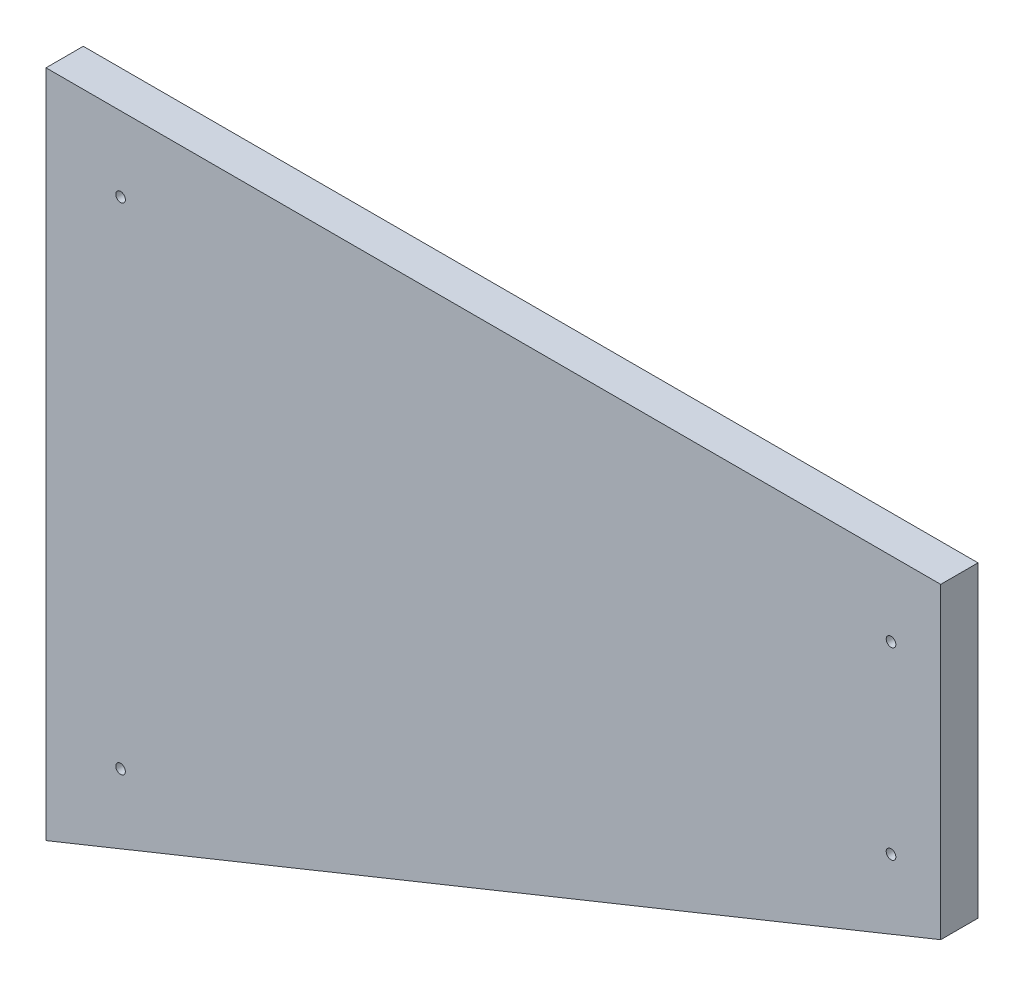
ISO-10303-21;
HEADER;
FILE_DESCRIPTION(('STEP AP214'),'2;1');
FILE_NAME('part.step','',(''),(''),'','','');
FILE_SCHEMA(('AUTOMOTIVE_DESIGN { 1 0 10303 214 1 1 1 1 }'));
ENDSEC;
DATA;
#1=APPLICATION_CONTEXT('core data for automotive mechanical design processes');
#2=APPLICATION_PROTOCOL_DEFINITION('international standard','automotive_design',2000,#1);
#3=PRODUCT_CONTEXT('',#1,'mechanical');
#4=PRODUCT('Part','Part','',(#3));
#5=PRODUCT_RELATED_PRODUCT_CATEGORY('part','',(#4));
#6=PRODUCT_DEFINITION_FORMATION('','',#4);
#7=PRODUCT_DEFINITION_CONTEXT('part definition',#1,'design');
#8=PRODUCT_DEFINITION('design','',#6,#7);
#9=PRODUCT_DEFINITION_SHAPE('','',#8);
#10=(LENGTH_UNIT() NAMED_UNIT(*) SI_UNIT(.MILLI.,.METRE.));
#11=(NAMED_UNIT(*) PLANE_ANGLE_UNIT() SI_UNIT($,.RADIAN.));
#12=(NAMED_UNIT(*) SI_UNIT($,.STERADIAN.) SOLID_ANGLE_UNIT());
#13=UNCERTAINTY_MEASURE_WITH_UNIT(LENGTH_MEASURE(1.E-05),#10,'distance_accuracy_value','');
#14=(GEOMETRIC_REPRESENTATION_CONTEXT(3) GLOBAL_UNCERTAINTY_ASSIGNED_CONTEXT((#13)) GLOBAL_UNIT_ASSIGNED_CONTEXT((#10,
#11,#12)) REPRESENTATION_CONTEXT('',''));
#15=CARTESIAN_POINT('',(0.,0.,0.));
#16=DIRECTION('',(0.,0.,1.));
#17=DIRECTION('',(1.,0.,0.));
#18=AXIS2_PLACEMENT_3D('',#15,#16,#17);
#19=CARTESIAN_POINT('',(3140.70999999981,6983.72999014018,19.05));
#20=DIRECTION('',(0.,-1.,0.));
#21=DIRECTION('',(1.,0.,0.));
#22=AXIS2_PLACEMENT_3D('',#19,#20,#21);
#23=PLANE('',#22);
#24=DIRECTION('',(-1.,0.,0.));
#25=VECTOR('',#24,1.);
#26=CARTESIAN_POINT('',(3140.70999999981,6983.72999014018,0.));
#27=LINE('',#26,#25);
#28=CARTESIAN_POINT('',(3140.70999999981,6983.72999014018,0.));
#29=VERTEX_POINT('',#28);
#30=CARTESIAN_POINT('',(2683.50999999981,6983.72999014018,0.));
#31=VERTEX_POINT('',#30);
#32=EDGE_CURVE('E100',#29,#31,#27,.T.);
#33=ORIENTED_EDGE('',*,*,#32,.T.);
#34=DIRECTION('',(0.,0.,-1.));
#35=VECTOR('',#34,1.);
#36=CARTESIAN_POINT('',(2683.50999999981,6983.72999014018,19.05));
#37=LINE('',#36,#35);
#38=CARTESIAN_POINT('',(2683.50999999981,6983.72999014018,19.05));
#39=VERTEX_POINT('',#38);
#40=EDGE_CURVE('E11',#39,#31,#37,.T.);
#41=ORIENTED_EDGE('',*,*,#40,.F.);
#42=DIRECTION('',(-1.,0.,0.));
#43=VECTOR('',#42,1.);
#44=CARTESIAN_POINT('',(3140.70999999981,6983.72999014018,19.05));
#45=LINE('',#44,#43);
#46=CARTESIAN_POINT('',(3140.70999999981,6983.72999014018,19.05));
#47=VERTEX_POINT('',#46);
#48=EDGE_CURVE('E88',#47,#39,#45,.T.);
#49=ORIENTED_EDGE('',*,*,#48,.F.);
#50=DIRECTION('',(0.,0.,-1.));
#51=VECTOR('',#50,1.);
#52=CARTESIAN_POINT('',(3140.70999999981,6983.72999014018,19.05));
#53=LINE('',#52,#51);
#54=EDGE_CURVE('E96',#47,#29,#53,.T.);
#55=ORIENTED_EDGE('',*,*,#54,.T.);
#56=EDGE_LOOP('',(#33,#41,#49,#55));
#57=FACE_BOUND('',#56,.T.);
#58=ADVANCED_FACE('F37',(#57),#23,.F.);
#59=CARTESIAN_POINT('',(2683.50999999981,6983.72999014018,19.05));
#60=DIRECTION('',(1.,0.,0.));
#61=DIRECTION('',(0.,0.,-1.));
#62=AXIS2_PLACEMENT_3D('',#59,#60,#61);
#63=PLANE('',#62);
#64=DIRECTION('',(0.,-1.,0.));
#65=VECTOR('',#64,1.);
#66=CARTESIAN_POINT('',(2683.50999999981,6983.72999014018,0.));
#67=LINE('',#66,#65);
#68=CARTESIAN_POINT('',(2683.50999999981,6641.74188684795,0.));
#69=VERTEX_POINT('',#68);
#70=EDGE_CURVE('E92',#31,#69,#67,.T.);
#71=ORIENTED_EDGE('',*,*,#70,.T.);
#72=DIRECTION('',(0.,0.,-1.));
#73=VECTOR('',#72,1.);
#74=CARTESIAN_POINT('',(2683.50999999981,6641.74188684795,19.05));
#75=LINE('',#74,#73);
#76=CARTESIAN_POINT('',(2683.50999999981,6641.74188684795,19.05));
#77=VERTEX_POINT('',#76);
#78=EDGE_CURVE('E45',#77,#69,#75,.T.);
#79=ORIENTED_EDGE('',*,*,#78,.F.);
#80=DIRECTION('',(0.,-1.,0.));
#81=VECTOR('',#80,1.);
#82=CARTESIAN_POINT('',(2683.50999999981,6983.72999014018,19.05));
#83=LINE('',#82,#81);
#84=EDGE_CURVE('E83',#39,#77,#83,.T.);
#85=ORIENTED_EDGE('',*,*,#84,.F.);
#86=ORIENTED_EDGE('',*,*,#40,.T.);
#87=EDGE_LOOP('',(#71,#79,#85,#86));
#88=FACE_BOUND('',#87,.T.);
#89=ADVANCED_FACE('F91',(#88),#63,.F.);
#90=CARTESIAN_POINT('',(2683.50999999981,6641.74188684795,19.05));
#91=DIRECTION('',(-0.374606593415956,0.927183854566769,0.));
#92=DIRECTION('',(-0.92718385456677,-0.374606593415956,0.));
#93=AXIS2_PLACEMENT_3D('',#90,#91,#92);
#94=PLANE('',#93);
#95=DIRECTION('',(0.927183854566769,0.374606593415956,0.));
#96=VECTOR('',#95,1.);
#97=CARTESIAN_POINT('',(2683.50999999981,6641.74188684795,0.));
#98=LINE('',#97,#96);
#99=CARTESIAN_POINT('',(3140.70999999981,6826.46267729981,0.));
#100=VERTEX_POINT('',#99);
#101=EDGE_CURVE('E70',#69,#100,#98,.T.);
#102=ORIENTED_EDGE('',*,*,#101,.T.);
#103=DIRECTION('',(0.,0.,-1.));
#104=VECTOR('',#103,1.);
#105=CARTESIAN_POINT('',(3140.70999999981,6826.46267729981,19.05));
#106=LINE('',#105,#104);
#107=CARTESIAN_POINT('',(3140.70999999981,6826.46267729981,19.05));
#108=VERTEX_POINT('',#107);
#109=EDGE_CURVE('E93',#108,#100,#106,.T.);
#110=ORIENTED_EDGE('',*,*,#109,.F.);
#111=DIRECTION('',(0.927183854566769,0.374606593415956,0.));
#112=VECTOR('',#111,1.);
#113=CARTESIAN_POINT('',(2683.50999999981,6641.74188684795,19.05));
#114=LINE('',#113,#112);
#115=EDGE_CURVE('E86',#77,#108,#114,.T.);
#116=ORIENTED_EDGE('',*,*,#115,.F.);
#117=ORIENTED_EDGE('',*,*,#78,.T.);
#118=EDGE_LOOP('',(#102,#110,#116,#117));
#119=FACE_BOUND('',#118,.T.);
#120=ADVANCED_FACE('F94',(#119),#94,.F.);
#121=CARTESIAN_POINT('',(3140.70999999981,6826.46267729981,19.05));
#122=DIRECTION('',(-1.,0.,0.));
#123=DIRECTION('',(0.,0.,1.));
#124=AXIS2_PLACEMENT_3D('',#121,#122,#123);
#125=PLANE('',#124);
#126=DIRECTION('',(0.,1.,0.));
#127=VECTOR('',#126,1.);
#128=CARTESIAN_POINT('',(3140.70999999981,6826.46267729981,0.));
#129=LINE('',#128,#127);
#130=EDGE_CURVE('E76',#100,#29,#129,.T.);
#131=ORIENTED_EDGE('',*,*,#130,.T.);
#132=ORIENTED_EDGE('',*,*,#54,.F.);
#133=DIRECTION('',(0.,1.,0.));
#134=VECTOR('',#133,1.);
#135=CARTESIAN_POINT('',(3140.70999999981,6826.46267729981,19.05));
#136=LINE('',#135,#134);
#137=EDGE_CURVE('E53',#108,#47,#136,.T.);
#138=ORIENTED_EDGE('',*,*,#137,.F.);
#139=ORIENTED_EDGE('',*,*,#109,.T.);
#140=EDGE_LOOP('',(#131,#132,#138,#139));
#141=FACE_BOUND('',#140,.T.);
#142=ADVANCED_FACE('F108',(#141),#125,.F.);
#143=CARTESIAN_POINT('',(0.,0.,19.05));
#144=DIRECTION('',(0.,0.,1.));
#145=DIRECTION('',(1.,0.,0.));
#146=AXIS2_PLACEMENT_3D('',#143,#144,#145);
#147=PLANE('',#146);
#148=CARTESIAN_POINT('',(2721.61000000056,6692.54189162913,19.05));
#149=DIRECTION('',(0.,0.,-1.));
#150=DIRECTION('',(-1.,0.,0.));
#151=AXIS2_PLACEMENT_3D('',#148,#149,#150);
#152=CIRCLE('',#151,2.45745000000008);
#153=CARTESIAN_POINT('',(2719.15255000056,6692.54189162913,19.05));
#154=VERTEX_POINT('',#153);
#155=EDGE_CURVE('E140',#154,#154,#152,.T.);
#156=ORIENTED_EDGE('',*,*,#155,.T.);
#157=EDGE_LOOP('',(#156));
#158=FACE_BOUND('',#157,.T.);
#159=CARTESIAN_POINT('',(2721.61000000058,6945.62999492127,19.05));
#160=DIRECTION('',(0.,0.,-1.));
#161=DIRECTION('',(-1.,0.,0.));
#162=AXIS2_PLACEMENT_3D('',#159,#160,#161);
#163=CIRCLE('',#162,2.45745000000008);
#164=CARTESIAN_POINT('',(2719.15255000058,6945.62999492127,19.05));
#165=VERTEX_POINT('',#164);
#166=EDGE_CURVE('E131',#165,#165,#163,.T.);
#167=ORIENTED_EDGE('',*,*,#166,.T.);
#168=EDGE_LOOP('',(#167));
#169=FACE_BOUND('',#168,.T.);
#170=CARTESIAN_POINT('',(3115.31000000058,6945.62999492124,19.05));
#171=DIRECTION('',(0.,0.,-1.));
#172=DIRECTION('',(-1.,0.,0.));
#173=AXIS2_PLACEMENT_3D('',#170,#171,#172);
#174=CIRCLE('',#173,2.45745000000008);
#175=CARTESIAN_POINT('',(3112.85255000058,6945.62999492124,19.05));
#176=VERTEX_POINT('',#175);
#177=EDGE_CURVE('E122',#176,#176,#174,.T.);
#178=ORIENTED_EDGE('',*,*,#177,.T.);
#179=EDGE_LOOP('',(#178));
#180=FACE_BOUND('',#179,.T.);
#181=CARTESIAN_POINT('',(3115.31000000057,6851.60701674041,19.05));
#182=DIRECTION('',(0.,0.,-1.));
#183=DIRECTION('',(-1.,0.,0.));
#184=AXIS2_PLACEMENT_3D('',#181,#182,#183);
#185=CIRCLE('',#184,2.45745000000008);
#186=CARTESIAN_POINT('',(3112.85255000057,6851.60701674041,19.05));
#187=VERTEX_POINT('',#186);
#188=EDGE_CURVE('E103',#187,#187,#185,.T.);
#189=ORIENTED_EDGE('',*,*,#188,.T.);
#190=EDGE_LOOP('',(#189));
#191=FACE_BOUND('',#190,.T.);
#192=ORIENTED_EDGE('',*,*,#48,.T.);
#193=ORIENTED_EDGE('',*,*,#84,.T.);
#194=ORIENTED_EDGE('',*,*,#115,.T.);
#195=ORIENTED_EDGE('',*,*,#137,.T.);
#196=EDGE_LOOP('',(#192,#193,#194,#195));
#197=FACE_BOUND('',#196,.T.);
#198=ADVANCED_FACE('F84',(#158,#169,#180,#191,#197),#147,.T.);
#199=CARTESIAN_POINT('',(0.,0.,0.));
#200=DIRECTION('',(0.,0.,1.));
#201=DIRECTION('',(1.,0.,0.));
#202=AXIS2_PLACEMENT_3D('',#199,#200,#201);
#203=PLANE('',#202);
#204=CARTESIAN_POINT('',(2721.61000000056,6692.54189162913,0.));
#205=DIRECTION('',(0.,0.,-1.));
#206=DIRECTION('',(-1.,0.,0.));
#207=AXIS2_PLACEMENT_3D('',#204,#205,#206);
#208=CIRCLE('',#207,4.21639999999979);
#209=CARTESIAN_POINT('',(2717.39360000056,6692.54189162913,0.));
#210=VERTEX_POINT('',#209);
#211=EDGE_CURVE('E146',#210,#210,#208,.T.);
#212=ORIENTED_EDGE('',*,*,#211,.F.);
#213=EDGE_LOOP('',(#212));
#214=FACE_BOUND('',#213,.T.);
#215=CARTESIAN_POINT('',(2721.61000000058,6945.62999492127,0.));
#216=DIRECTION('',(0.,0.,-1.));
#217=DIRECTION('',(-1.,0.,0.));
#218=AXIS2_PLACEMENT_3D('',#215,#216,#217);
#219=CIRCLE('',#218,4.21639999999979);
#220=CARTESIAN_POINT('',(2717.39360000058,6945.62999492127,0.));
#221=VERTEX_POINT('',#220);
#222=EDGE_CURVE('E137',#221,#221,#219,.T.);
#223=ORIENTED_EDGE('',*,*,#222,.F.);
#224=EDGE_LOOP('',(#223));
#225=FACE_BOUND('',#224,.T.);
#226=CARTESIAN_POINT('',(3115.31000000058,6945.62999492124,0.));
#227=DIRECTION('',(0.,0.,-1.));
#228=DIRECTION('',(-1.,0.,0.));
#229=AXIS2_PLACEMENT_3D('',#226,#227,#228);
#230=CIRCLE('',#229,4.21639999999979);
#231=CARTESIAN_POINT('',(3111.09360000058,6945.62999492124,0.));
#232=VERTEX_POINT('',#231);
#233=EDGE_CURVE('E128',#232,#232,#230,.T.);
#234=ORIENTED_EDGE('',*,*,#233,.F.);
#235=EDGE_LOOP('',(#234));
#236=FACE_BOUND('',#235,.T.);
#237=CARTESIAN_POINT('',(3115.31000000057,6851.60701674041,0.));
#238=DIRECTION('',(0.,0.,-1.));
#239=DIRECTION('',(-1.,0.,0.));
#240=AXIS2_PLACEMENT_3D('',#237,#238,#239);
#241=CIRCLE('',#240,4.21639999999979);
#242=CARTESIAN_POINT('',(3111.09360000057,6851.60701674041,0.));
#243=VERTEX_POINT('',#242);
#244=EDGE_CURVE('E119',#243,#243,#241,.T.);
#245=ORIENTED_EDGE('',*,*,#244,.F.);
#246=EDGE_LOOP('',(#245));
#247=FACE_BOUND('',#246,.T.);
#248=ORIENTED_EDGE('',*,*,#32,.F.);
#249=ORIENTED_EDGE('',*,*,#130,.F.);
#250=ORIENTED_EDGE('',*,*,#101,.F.);
#251=ORIENTED_EDGE('',*,*,#70,.F.);
#252=EDGE_LOOP('',(#248,#249,#250,#251));
#253=FACE_BOUND('',#252,.T.);
#254=ADVANCED_FACE('F111',(#214,#225,#236,#247,#253),#203,.F.);
#255=CARTESIAN_POINT('',(3115.31000000057,6851.60701674041,0.));
#256=DIRECTION('',(0.,0.,-1.));
#257=DIRECTION('',(-1.,0.,0.));
#258=AXIS2_PLACEMENT_3D('',#255,#256,#257);
#259=CYLINDRICAL_SURFACE('',#258,2.45745000000008);
#260=ORIENTED_EDGE('',*,*,#188,.F.);
#261=EDGE_LOOP('',(#260));
#262=FACE_BOUND('',#261,.T.);
#263=CARTESIAN_POINT('',(3115.31000000057,6851.60701674041,1.47593429625929));
#264=DIRECTION('',(0.,0.,-1.));
#265=DIRECTION('',(-1.,0.,0.));
#266=AXIS2_PLACEMENT_3D('',#263,#264,#265);
#267=CIRCLE('',#266,2.45745000000008);
#268=CARTESIAN_POINT('',(3112.85255000057,6851.60701674041,1.47593429625929));
#269=VERTEX_POINT('',#268);
#270=EDGE_CURVE('E116',#269,#269,#267,.T.);
#271=ORIENTED_EDGE('',*,*,#270,.T.);
#272=EDGE_LOOP('',(#271));
#273=FACE_BOUND('',#272,.T.);
#274=ADVANCED_FACE('F154',(#262,#273),#259,.F.);
#275=CARTESIAN_POINT('',(3115.31000000057,6851.60701674041,0.));
#276=DIRECTION('',(0.,0.,-1.));
#277=DIRECTION('',(-1.,0.,0.));
#278=AXIS2_PLACEMENT_3D('',#275,#276,#277);
#279=CONICAL_SURFACE('',#278,4.21639999999979,0.872664625997076);
#280=ORIENTED_EDGE('',*,*,#270,.F.);
#281=EDGE_LOOP('',(#280));
#282=FACE_BOUND('',#281,.T.);
#283=ORIENTED_EDGE('',*,*,#244,.T.);
#284=EDGE_LOOP('',(#283));
#285=FACE_BOUND('',#284,.T.);
#286=ADVANCED_FACE('F162',(#282,#285),#279,.F.);
#287=CARTESIAN_POINT('',(3115.31000000058,6945.62999492124,0.));
#288=DIRECTION('',(0.,0.,-1.));
#289=DIRECTION('',(-1.,0.,0.));
#290=AXIS2_PLACEMENT_3D('',#287,#288,#289);
#291=CYLINDRICAL_SURFACE('',#290,2.45745000000008);
#292=ORIENTED_EDGE('',*,*,#177,.F.);
#293=EDGE_LOOP('',(#292));
#294=FACE_BOUND('',#293,.T.);
#295=CARTESIAN_POINT('',(3115.31000000058,6945.62999492124,1.47593429625929));
#296=DIRECTION('',(0.,0.,-1.));
#297=DIRECTION('',(-1.,0.,0.));
#298=AXIS2_PLACEMENT_3D('',#295,#296,#297);
#299=CIRCLE('',#298,2.45745000000008);
#300=CARTESIAN_POINT('',(3112.85255000058,6945.62999492124,1.47593429625929));
#301=VERTEX_POINT('',#300);
#302=EDGE_CURVE('E125',#301,#301,#299,.T.);
#303=ORIENTED_EDGE('',*,*,#302,.T.);
#304=EDGE_LOOP('',(#303));
#305=FACE_BOUND('',#304,.T.);
#306=ADVANCED_FACE('F164',(#294,#305),#291,.F.);
#307=CARTESIAN_POINT('',(3115.31000000058,6945.62999492124,0.));
#308=DIRECTION('',(0.,0.,-1.));
#309=DIRECTION('',(-1.,0.,0.));
#310=AXIS2_PLACEMENT_3D('',#307,#308,#309);
#311=CONICAL_SURFACE('',#310,4.21639999999979,0.872664625997076);
#312=ORIENTED_EDGE('',*,*,#302,.F.);
#313=EDGE_LOOP('',(#312));
#314=FACE_BOUND('',#313,.T.);
#315=ORIENTED_EDGE('',*,*,#233,.T.);
#316=EDGE_LOOP('',(#315));
#317=FACE_BOUND('',#316,.T.);
#318=ADVANCED_FACE('F171',(#314,#317),#311,.F.);
#319=CARTESIAN_POINT('',(2721.61000000058,6945.62999492127,0.));
#320=DIRECTION('',(0.,0.,-1.));
#321=DIRECTION('',(-1.,0.,0.));
#322=AXIS2_PLACEMENT_3D('',#319,#320,#321);
#323=CYLINDRICAL_SURFACE('',#322,2.45745000000008);
#324=ORIENTED_EDGE('',*,*,#166,.F.);
#325=EDGE_LOOP('',(#324));
#326=FACE_BOUND('',#325,.T.);
#327=CARTESIAN_POINT('',(2721.61000000058,6945.62999492127,1.47593429625929));
#328=DIRECTION('',(0.,0.,-1.));
#329=DIRECTION('',(-1.,0.,0.));
#330=AXIS2_PLACEMENT_3D('',#327,#328,#329);
#331=CIRCLE('',#330,2.45745000000008);
#332=CARTESIAN_POINT('',(2719.15255000058,6945.62999492127,1.47593429625929));
#333=VERTEX_POINT('',#332);
#334=EDGE_CURVE('E134',#333,#333,#331,.T.);
#335=ORIENTED_EDGE('',*,*,#334,.T.);
#336=EDGE_LOOP('',(#335));
#337=FACE_BOUND('',#336,.T.);
#338=ADVANCED_FACE('F205',(#326,#337),#323,.F.);
#339=CARTESIAN_POINT('',(2721.61000000058,6945.62999492127,0.));
#340=DIRECTION('',(0.,0.,-1.));
#341=DIRECTION('',(-1.,0.,0.));
#342=AXIS2_PLACEMENT_3D('',#339,#340,#341);
#343=CONICAL_SURFACE('',#342,4.21639999999979,0.872664625997076);
#344=ORIENTED_EDGE('',*,*,#334,.F.);
#345=EDGE_LOOP('',(#344));
#346=FACE_BOUND('',#345,.T.);
#347=ORIENTED_EDGE('',*,*,#222,.T.);
#348=EDGE_LOOP('',(#347));
#349=FACE_BOUND('',#348,.T.);
#350=ADVANCED_FACE('F210',(#346,#349),#343,.F.);
#351=CARTESIAN_POINT('',(2721.61000000056,6692.54189162913,0.));
#352=DIRECTION('',(0.,0.,-1.));
#353=DIRECTION('',(-1.,0.,0.));
#354=AXIS2_PLACEMENT_3D('',#351,#352,#353);
#355=CYLINDRICAL_SURFACE('',#354,2.45745000000008);
#356=ORIENTED_EDGE('',*,*,#155,.F.);
#357=EDGE_LOOP('',(#356));
#358=FACE_BOUND('',#357,.T.);
#359=CARTESIAN_POINT('',(2721.61000000056,6692.54189162913,1.47593429625929));
#360=DIRECTION('',(0.,0.,-1.));
#361=DIRECTION('',(-1.,0.,0.));
#362=AXIS2_PLACEMENT_3D('',#359,#360,#361);
#363=CIRCLE('',#362,2.45745000000008);
#364=CARTESIAN_POINT('',(2719.15255000056,6692.54189162913,1.47593429625929));
#365=VERTEX_POINT('',#364);
#366=EDGE_CURVE('E143',#365,#365,#363,.T.);
#367=ORIENTED_EDGE('',*,*,#366,.T.);
#368=EDGE_LOOP('',(#367));
#369=FACE_BOUND('',#368,.T.);
#370=ADVANCED_FACE('F216',(#358,#369),#355,.F.);
#371=CARTESIAN_POINT('',(2721.61000000056,6692.54189162913,0.));
#372=DIRECTION('',(0.,0.,-1.));
#373=DIRECTION('',(-1.,0.,0.));
#374=AXIS2_PLACEMENT_3D('',#371,#372,#373);
#375=CONICAL_SURFACE('',#374,4.21639999999979,0.872664625997076);
#376=ORIENTED_EDGE('',*,*,#366,.F.);
#377=EDGE_LOOP('',(#376));
#378=FACE_BOUND('',#377,.T.);
#379=ORIENTED_EDGE('',*,*,#211,.T.);
#380=EDGE_LOOP('',(#379));
#381=FACE_BOUND('',#380,.T.);
#382=ADVANCED_FACE('F150',(#378,#381),#375,.F.);
#383=CLOSED_SHELL('',(#58,#89,#120,#142,#198,#254,#274,#286,#306,#318,#338,#350,#370,#382));
#384=MANIFOLD_SOLID_BREP('B2',#383);
#385=ADVANCED_BREP_SHAPE_REPRESENTATION('',(#18,#384),#14);
#386=SHAPE_DEFINITION_REPRESENTATION(#9,#385);
ENDSEC;
END-ISO-10303-21;
